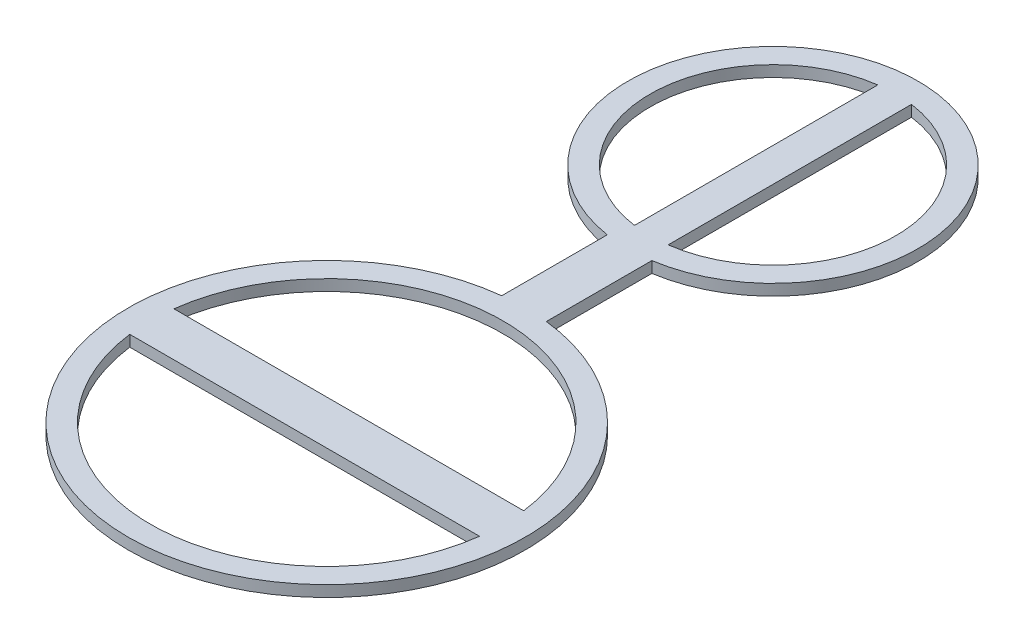
ISO-10303-21;
HEADER;
FILE_DESCRIPTION(('STEP AP214'),'2;1');
FILE_NAME('part.step','',(''),(''),'','','');
FILE_SCHEMA(('AUTOMOTIVE_DESIGN { 1 0 10303 214 1 1 1 1 }'));
ENDSEC;
DATA;
#1=APPLICATION_CONTEXT('core data for automotive mechanical design processes');
#2=APPLICATION_PROTOCOL_DEFINITION('international standard','automotive_design',2000,#1);
#3=PRODUCT_CONTEXT('',#1,'mechanical');
#4=PRODUCT('Part','Part','',(#3));
#5=PRODUCT_RELATED_PRODUCT_CATEGORY('part','',(#4));
#6=PRODUCT_DEFINITION_FORMATION('','',#4);
#7=PRODUCT_DEFINITION_CONTEXT('part definition',#1,'design');
#8=PRODUCT_DEFINITION('design','',#6,#7);
#9=PRODUCT_DEFINITION_SHAPE('','',#8);
#10=(LENGTH_UNIT() NAMED_UNIT(*) SI_UNIT(.MILLI.,.METRE.));
#11=(NAMED_UNIT(*) PLANE_ANGLE_UNIT() SI_UNIT($,.RADIAN.));
#12=(NAMED_UNIT(*) SI_UNIT($,.STERADIAN.) SOLID_ANGLE_UNIT());
#13=UNCERTAINTY_MEASURE_WITH_UNIT(LENGTH_MEASURE(1.E-05),#10,'distance_accuracy_value','');
#14=(GEOMETRIC_REPRESENTATION_CONTEXT(3) GLOBAL_UNCERTAINTY_ASSIGNED_CONTEXT((#13)) GLOBAL_UNIT_ASSIGNED_CONTEXT((#10,
#11,#12)) REPRESENTATION_CONTEXT('',''));
#15=CARTESIAN_POINT('',(0.,0.,0.));
#16=DIRECTION('',(0.,0.,1.));
#17=DIRECTION('',(1.,0.,0.));
#18=AXIS2_PLACEMENT_3D('',#15,#16,#17);
#19=CARTESIAN_POINT('',(0.,5.,0.));
#20=DIRECTION('',(0.,-1.,0.));
#21=DIRECTION('',(0.,0.,-1.));
#22=AXIS2_PLACEMENT_3D('',#19,#20,#21);
#23=CYLINDRICAL_SURFACE('',#22,79.);
#24=CARTESIAN_POINT('',(0.,0.,0.));
#25=DIRECTION('',(0.,1.,0.));
#26=DIRECTION('',(0.,0.,1.));
#27=AXIS2_PLACEMENT_3D('',#24,#25,#26);
#28=CIRCLE('',#27,79.);
#29=CARTESIAN_POINT('',(-78.3772288359317,0.,9.90000000000001));
#30=VERTEX_POINT('',#29);
#31=CARTESIAN_POINT('',(78.3772288359317,0.,9.9));
#32=VERTEX_POINT('',#31);
#33=EDGE_CURVE('E208',#30,#32,#28,.T.);
#34=ORIENTED_EDGE('',*,*,#33,.F.);
#35=DIRECTION('',(0.,-1.,0.));
#36=VECTOR('',#35,1.);
#37=CARTESIAN_POINT('',(-78.3772288359317,5.,9.90000000000001));
#38=LINE('',#37,#36);
#39=CARTESIAN_POINT('',(-78.3772288359317,5.,9.90000000000001));
#40=VERTEX_POINT('',#39);
#41=EDGE_CURVE('E11',#40,#30,#38,.T.);
#42=ORIENTED_EDGE('',*,*,#41,.F.);
#43=CARTESIAN_POINT('',(0.,5.,0.));
#44=DIRECTION('',(0.,1.,0.));
#45=DIRECTION('',(0.,0.,1.));
#46=AXIS2_PLACEMENT_3D('',#43,#44,#45);
#47=CIRCLE('',#46,79.);
#48=CARTESIAN_POINT('',(78.3772288359317,5.,9.9));
#49=VERTEX_POINT('',#48);
#50=EDGE_CURVE('E162',#40,#49,#47,.T.);
#51=ORIENTED_EDGE('',*,*,#50,.T.);
#52=DIRECTION('',(0.,-1.,0.));
#53=VECTOR('',#52,1.);
#54=CARTESIAN_POINT('',(78.3772288359317,5.,9.9));
#55=LINE('',#54,#53);
#56=EDGE_CURVE('E55',#49,#32,#55,.T.);
#57=ORIENTED_EDGE('',*,*,#56,.T.);
#58=EDGE_LOOP('',(#34,#42,#51,#57));
#59=FACE_BOUND('',#58,.T.);
#60=ADVANCED_FACE('F44',(#59),#23,.F.);
#61=CARTESIAN_POINT('',(0.,5.,0.));
#62=DIRECTION('',(0.,-1.,0.));
#63=DIRECTION('',(0.,0.,-1.));
#64=AXIS2_PLACEMENT_3D('',#61,#62,#63);
#65=CYLINDRICAL_SURFACE('',#64,79.);
#66=CARTESIAN_POINT('',(0.,0.,0.));
#67=DIRECTION('',(0.,1.,0.));
#68=DIRECTION('',(0.,0.,1.));
#69=AXIS2_PLACEMENT_3D('',#66,#67,#68);
#70=CIRCLE('',#69,79.);
#71=CARTESIAN_POINT('',(78.3772288359317,0.,-9.9));
#72=VERTEX_POINT('',#71);
#73=CARTESIAN_POINT('',(-78.3772288359317,0.,-9.89999999999999));
#74=VERTEX_POINT('',#73);
#75=EDGE_CURVE('E203',#72,#74,#70,.T.);
#76=ORIENTED_EDGE('',*,*,#75,.F.);
#77=DIRECTION('',(0.,-1.,0.));
#78=VECTOR('',#77,1.);
#79=CARTESIAN_POINT('',(78.3772288359317,5.,-9.9));
#80=LINE('',#79,#78);
#81=CARTESIAN_POINT('',(78.3772288359317,5.,-9.9));
#82=VERTEX_POINT('',#81);
#83=EDGE_CURVE('E149',#82,#72,#80,.T.);
#84=ORIENTED_EDGE('',*,*,#83,.F.);
#85=CARTESIAN_POINT('',(0.,5.,0.));
#86=DIRECTION('',(0.,1.,0.));
#87=DIRECTION('',(0.,0.,1.));
#88=AXIS2_PLACEMENT_3D('',#85,#86,#87);
#89=CIRCLE('',#88,79.);
#90=CARTESIAN_POINT('',(-78.3772288359317,5.,-9.89999999999999));
#91=VERTEX_POINT('',#90);
#92=EDGE_CURVE('E153',#82,#91,#89,.T.);
#93=ORIENTED_EDGE('',*,*,#92,.T.);
#94=DIRECTION('',(0.,-1.,0.));
#95=VECTOR('',#94,1.);
#96=CARTESIAN_POINT('',(-78.3772288359317,5.,-9.89999999999999));
#97=LINE('',#96,#95);
#98=EDGE_CURVE('E138',#91,#74,#97,.T.);
#99=ORIENTED_EDGE('',*,*,#98,.T.);
#100=EDGE_LOOP('',(#76,#84,#93,#99));
#101=FACE_BOUND('',#100,.T.);
#102=ADVANCED_FACE('F154',(#101),#65,.F.);
#103=CARTESIAN_POINT('',(10.,5.,0.));
#104=DIRECTION('',(-1.,0.,0.));
#105=DIRECTION('',(0.,0.,1.));
#106=AXIS2_PLACEMENT_3D('',#103,#104,#105);
#107=PLANE('',#106);
#108=DIRECTION('',(0.,0.,-1.));
#109=VECTOR('',#108,1.);
#110=CARTESIAN_POINT('',(10.,0.,0.));
#111=LINE('',#110,#109);
#112=CARTESIAN_POINT('',(10.,0.,-88.436417837902));
#113=VERTEX_POINT('',#112);
#114=CARTESIAN_POINT('',(10.,0.,-135.72323514675));
#115=VERTEX_POINT('',#114);
#116=EDGE_CURVE('E188',#113,#115,#111,.T.);
#117=ORIENTED_EDGE('',*,*,#116,.T.);
#118=DIRECTION('',(0.,-1.,0.));
#119=VECTOR('',#118,1.);
#120=CARTESIAN_POINT('',(10.,5.,-135.72323514675));
#121=LINE('',#120,#119);
#122=CARTESIAN_POINT('',(10.,5.,-135.72323514675));
#123=VERTEX_POINT('',#122);
#124=EDGE_CURVE('E150',#123,#115,#121,.T.);
#125=ORIENTED_EDGE('',*,*,#124,.F.);
#126=DIRECTION('',(0.,0.,-1.));
#127=VECTOR('',#126,1.);
#128=CARTESIAN_POINT('',(10.,5.,0.));
#129=LINE('',#128,#127);
#130=CARTESIAN_POINT('',(10.,5.,-88.436417837902));
#131=VERTEX_POINT('',#130);
#132=EDGE_CURVE('E437',#131,#123,#129,.T.);
#133=ORIENTED_EDGE('',*,*,#132,.F.);
#134=DIRECTION('',(0.,-1.,0.));
#135=VECTOR('',#134,1.);
#136=CARTESIAN_POINT('',(10.,5.,-88.436417837902));
#137=LINE('',#136,#135);
#138=EDGE_CURVE('E220',#131,#113,#137,.T.);
#139=ORIENTED_EDGE('',*,*,#138,.T.);
#140=EDGE_LOOP('',(#117,#125,#133,#139));
#141=FACE_BOUND('',#140,.T.);
#142=ADVANCED_FACE('F265',(#141),#107,.F.);
#143=CARTESIAN_POINT('',(0.,5.,-200.));
#144=DIRECTION('',(0.,-1.,0.));
#145=DIRECTION('',(0.,0.,-1.));
#146=AXIS2_PLACEMENT_3D('',#143,#144,#145);
#147=CYLINDRICAL_SURFACE('',#146,65.05);
#148=CARTESIAN_POINT('',(0.,0.,-200.));
#149=DIRECTION('',(0.,1.,0.));
#150=DIRECTION('',(0.,0.,1.));
#151=AXIS2_PLACEMENT_3D('',#148,#149,#150);
#152=CIRCLE('',#151,65.05);
#153=CARTESIAN_POINT('',(-10.,0.,-135.72323514675));
#154=VERTEX_POINT('',#153);
#155=EDGE_CURVE('E192',#115,#154,#152,.T.);
#156=ORIENTED_EDGE('',*,*,#155,.T.);
#157=DIRECTION('',(0.,-1.,0.));
#158=VECTOR('',#157,1.);
#159=CARTESIAN_POINT('',(-10.,5.,-135.72323514675));
#160=LINE('',#159,#158);
#161=CARTESIAN_POINT('',(-10.,5.,-135.72323514675));
#162=VERTEX_POINT('',#161);
#163=EDGE_CURVE('E228',#162,#154,#160,.T.);
#164=ORIENTED_EDGE('',*,*,#163,.F.);
#165=CARTESIAN_POINT('',(0.,5.,-200.));
#166=DIRECTION('',(0.,1.,0.));
#167=DIRECTION('',(0.,0.,1.));
#168=AXIS2_PLACEMENT_3D('',#165,#166,#167);
#169=CIRCLE('',#168,65.05);
#170=EDGE_CURVE('E440',#123,#162,#169,.T.);
#171=ORIENTED_EDGE('',*,*,#170,.F.);
#172=ORIENTED_EDGE('',*,*,#124,.T.);
#173=EDGE_LOOP('',(#156,#164,#171,#172));
#174=FACE_BOUND('',#173,.T.);
#175=ADVANCED_FACE('F277',(#174),#147,.T.);
#176=CARTESIAN_POINT('',(-10.,5.,0.));
#177=DIRECTION('',(-1.,0.,0.));
#178=DIRECTION('',(0.,0.,1.));
#179=AXIS2_PLACEMENT_3D('',#176,#177,#178);
#180=PLANE('',#179);
#181=DIRECTION('',(0.,0.,-1.));
#182=VECTOR('',#181,1.);
#183=CARTESIAN_POINT('',(-10.,0.,0.));
#184=LINE('',#183,#182);
#185=CARTESIAN_POINT('',(-10.,0.,-88.436417837902));
#186=VERTEX_POINT('',#185);
#187=EDGE_CURVE('E196',#186,#154,#184,.T.);
#188=ORIENTED_EDGE('',*,*,#187,.F.);
#189=DIRECTION('',(0.,-1.,0.));
#190=VECTOR('',#189,1.);
#191=CARTESIAN_POINT('',(-10.,5.,-88.436417837902));
#192=LINE('',#191,#190);
#193=CARTESIAN_POINT('',(-10.,5.,-88.436417837902));
#194=VERTEX_POINT('',#193);
#195=EDGE_CURVE('E224',#194,#186,#192,.T.);
#196=ORIENTED_EDGE('',*,*,#195,.F.);
#197=DIRECTION('',(0.,0.,-1.));
#198=VECTOR('',#197,1.);
#199=CARTESIAN_POINT('',(-10.,5.,0.));
#200=LINE('',#199,#198);
#201=EDGE_CURVE('E450',#194,#162,#200,.T.);
#202=ORIENTED_EDGE('',*,*,#201,.T.);
#203=ORIENTED_EDGE('',*,*,#163,.T.);
#204=EDGE_LOOP('',(#188,#196,#202,#203));
#205=FACE_BOUND('',#204,.T.);
#206=ADVANCED_FACE('F257',(#205),#180,.T.);
#207=CARTESIAN_POINT('',(7.55000000000071,5.,0.));
#208=DIRECTION('',(1.,0.,0.));
#209=DIRECTION('',(0.,0.,-1.));
#210=AXIS2_PLACEMENT_3D('',#207,#208,#209);
#211=PLANE('',#210);
#212=DIRECTION('',(0.,0.,1.));
#213=VECTOR('',#212,1.);
#214=CARTESIAN_POINT('',(7.55000000000071,0.,0.));
#215=LINE('',#214,#213);
#216=CARTESIAN_POINT('',(7.54999999999981,0.,-254.529808362033));
#217=VERTEX_POINT('',#216);
#218=CARTESIAN_POINT('',(7.55000000000019,0.,-145.470191637967));
#219=VERTEX_POINT('',#218);
#220=EDGE_CURVE('E180',#217,#219,#215,.T.);
#221=ORIENTED_EDGE('',*,*,#220,.F.);
#222=DIRECTION('',(0.,-1.,0.));
#223=VECTOR('',#222,1.);
#224=CARTESIAN_POINT('',(7.54999999999981,5.,-254.529808362033));
#225=LINE('',#224,#223);
#226=CARTESIAN_POINT('',(7.54999999999981,5.,-254.529808362033));
#227=VERTEX_POINT('',#226);
#228=EDGE_CURVE('E225',#227,#217,#225,.T.);
#229=ORIENTED_EDGE('',*,*,#228,.F.);
#230=DIRECTION('',(0.,0.,1.));
#231=VECTOR('',#230,1.);
#232=CARTESIAN_POINT('',(7.55000000000071,5.,0.));
#233=LINE('',#232,#231);
#234=CARTESIAN_POINT('',(7.55000000000019,5.,-145.470191637967));
#235=VERTEX_POINT('',#234);
#236=EDGE_CURVE('E433',#227,#235,#233,.T.);
#237=ORIENTED_EDGE('',*,*,#236,.T.);
#238=DIRECTION('',(0.,-1.,0.));
#239=VECTOR('',#238,1.);
#240=CARTESIAN_POINT('',(7.55000000000019,5.,-145.470191637967));
#241=LINE('',#240,#239);
#242=EDGE_CURVE('E234',#235,#219,#241,.T.);
#243=ORIENTED_EDGE('',*,*,#242,.T.);
#244=EDGE_LOOP('',(#221,#229,#237,#243));
#245=FACE_BOUND('',#244,.T.);
#246=ADVANCED_FACE('F250',(#245),#211,.T.);
#247=CARTESIAN_POINT('',(0.,5.,-200.));
#248=DIRECTION('',(0.,-1.,0.));
#249=DIRECTION('',(0.,0.,-1.));
#250=AXIS2_PLACEMENT_3D('',#247,#248,#249);
#251=CYLINDRICAL_SURFACE('',#250,55.05);
#252=CARTESIAN_POINT('',(0.,0.,-200.));
#253=DIRECTION('',(0.,1.,0.));
#254=DIRECTION('',(0.,0.,1.));
#255=AXIS2_PLACEMENT_3D('',#252,#253,#254);
#256=CIRCLE('',#255,55.05);
#257=CARTESIAN_POINT('',(-7.55000000000019,0.,-254.529808362033));
#258=VERTEX_POINT('',#257);
#259=CARTESIAN_POINT('',(-7.54999999999981,0.,-145.470191637967));
#260=VERTEX_POINT('',#259);
#261=EDGE_CURVE('E172',#258,#260,#256,.T.);
#262=ORIENTED_EDGE('',*,*,#261,.F.);
#263=DIRECTION('',(0.,-1.,0.));
#264=VECTOR('',#263,1.);
#265=CARTESIAN_POINT('',(-7.55000000000019,5.,-254.529808362033));
#266=LINE('',#265,#264);
#267=CARTESIAN_POINT('',(-7.55000000000019,5.,-254.529808362033));
#268=VERTEX_POINT('',#267);
#269=EDGE_CURVE('E48',#268,#258,#266,.T.);
#270=ORIENTED_EDGE('',*,*,#269,.F.);
#271=CARTESIAN_POINT('',(0.,5.,-200.));
#272=DIRECTION('',(0.,1.,0.));
#273=DIRECTION('',(0.,0.,1.));
#274=AXIS2_PLACEMENT_3D('',#271,#272,#273);
#275=CIRCLE('',#274,55.05);
#276=CARTESIAN_POINT('',(-7.54999999999981,5.,-145.470191637967));
#277=VERTEX_POINT('',#276);
#278=EDGE_CURVE('E215',#268,#277,#275,.T.);
#279=ORIENTED_EDGE('',*,*,#278,.T.);
#280=DIRECTION('',(0.,-1.,0.));
#281=VECTOR('',#280,1.);
#282=CARTESIAN_POINT('',(-7.54999999999981,5.,-145.470191637967));
#283=LINE('',#282,#281);
#284=EDGE_CURVE('E171',#277,#260,#283,.T.);
#285=ORIENTED_EDGE('',*,*,#284,.T.);
#286=EDGE_LOOP('',(#262,#270,#279,#285));
#287=FACE_BOUND('',#286,.T.);
#288=ADVANCED_FACE('F46',(#287),#251,.F.);
#289=CARTESIAN_POINT('',(0.,5.,-9.9));
#290=DIRECTION('',(0.,0.,-1.));
#291=DIRECTION('',(-1.,0.,0.));
#292=AXIS2_PLACEMENT_3D('',#289,#290,#291);
#293=PLANE('',#292);
#294=DIRECTION('',(1.,0.,0.));
#295=VECTOR('',#294,1.);
#296=CARTESIAN_POINT('',(0.,0.,-9.9));
#297=LINE('',#296,#295);
#298=EDGE_CURVE('E144',#74,#72,#297,.T.);
#299=ORIENTED_EDGE('',*,*,#298,.F.);
#300=ORIENTED_EDGE('',*,*,#98,.F.);
#301=DIRECTION('',(1.,0.,0.));
#302=VECTOR('',#301,1.);
#303=CARTESIAN_POINT('',(0.,5.,-9.9));
#304=LINE('',#303,#302);
#305=EDGE_CURVE('E142',#91,#82,#304,.T.);
#306=ORIENTED_EDGE('',*,*,#305,.T.);
#307=ORIENTED_EDGE('',*,*,#83,.T.);
#308=EDGE_LOOP('',(#299,#300,#306,#307));
#309=FACE_BOUND('',#308,.T.);
#310=ADVANCED_FACE('F140',(#309),#293,.T.);
#311=CARTESIAN_POINT('',(0.,5.,0.));
#312=DIRECTION('',(0.,-1.,0.));
#313=DIRECTION('',(0.,0.,-1.));
#314=AXIS2_PLACEMENT_3D('',#311,#312,#313);
#315=CYLINDRICAL_SURFACE('',#314,89.);
#316=CARTESIAN_POINT('',(0.,0.,0.));
#317=DIRECTION('',(0.,1.,0.));
#318=DIRECTION('',(0.,0.,1.));
#319=AXIS2_PLACEMENT_3D('',#316,#317,#318);
#320=CIRCLE('',#319,89.);
#321=EDGE_CURVE('E200',#186,#113,#320,.T.);
#322=ORIENTED_EDGE('',*,*,#321,.T.);
#323=ORIENTED_EDGE('',*,*,#138,.F.);
#324=CARTESIAN_POINT('',(0.,5.,0.));
#325=DIRECTION('',(0.,1.,0.));
#326=DIRECTION('',(0.,0.,1.));
#327=AXIS2_PLACEMENT_3D('',#324,#325,#326);
#328=CIRCLE('',#327,89.);
#329=EDGE_CURVE('E157',#194,#131,#328,.T.);
#330=ORIENTED_EDGE('',*,*,#329,.F.);
#331=ORIENTED_EDGE('',*,*,#195,.T.);
#332=EDGE_LOOP('',(#322,#323,#330,#331));
#333=FACE_BOUND('',#332,.T.);
#334=ADVANCED_FACE('F255',(#333),#315,.T.);
#335=CARTESIAN_POINT('',(0.,5.,-200.));
#336=DIRECTION('',(0.,-1.,0.));
#337=DIRECTION('',(0.,0.,-1.));
#338=AXIS2_PLACEMENT_3D('',#335,#336,#337);
#339=CYLINDRICAL_SURFACE('',#338,55.05);
#340=CARTESIAN_POINT('',(0.,0.,-200.));
#341=DIRECTION('',(0.,1.,0.));
#342=DIRECTION('',(0.,0.,1.));
#343=AXIS2_PLACEMENT_3D('',#340,#341,#342);
#344=CIRCLE('',#343,55.05);
#345=EDGE_CURVE('E184',#219,#217,#344,.T.);
#346=ORIENTED_EDGE('',*,*,#345,.F.);
#347=ORIENTED_EDGE('',*,*,#242,.F.);
#348=CARTESIAN_POINT('',(0.,5.,-200.));
#349=DIRECTION('',(0.,1.,0.));
#350=DIRECTION('',(0.,0.,1.));
#351=AXIS2_PLACEMENT_3D('',#348,#349,#350);
#352=CIRCLE('',#351,55.05);
#353=EDGE_CURVE('E445',#235,#227,#352,.T.);
#354=ORIENTED_EDGE('',*,*,#353,.T.);
#355=ORIENTED_EDGE('',*,*,#228,.T.);
#356=EDGE_LOOP('',(#346,#347,#354,#355));
#357=FACE_BOUND('',#356,.T.);
#358=ADVANCED_FACE('F273',(#357),#339,.F.);
#359=CARTESIAN_POINT('',(-7.54999999999929,5.,0.));
#360=DIRECTION('',(1.,0.,0.));
#361=DIRECTION('',(0.,0.,-1.));
#362=AXIS2_PLACEMENT_3D('',#359,#360,#361);
#363=PLANE('',#362);
#364=DIRECTION('',(0.,0.,1.));
#365=VECTOR('',#364,1.);
#366=CARTESIAN_POINT('',(-7.54999999999929,0.,0.));
#367=LINE('',#366,#365);
#368=EDGE_CURVE('E176',#258,#260,#367,.T.);
#369=ORIENTED_EDGE('',*,*,#368,.T.);
#370=ORIENTED_EDGE('',*,*,#284,.F.);
#371=DIRECTION('',(0.,0.,1.));
#372=VECTOR('',#371,1.);
#373=CARTESIAN_POINT('',(-7.54999999999929,5.,0.));
#374=LINE('',#373,#372);
#375=EDGE_CURVE('E244',#268,#277,#374,.T.);
#376=ORIENTED_EDGE('',*,*,#375,.F.);
#377=ORIENTED_EDGE('',*,*,#269,.T.);
#378=EDGE_LOOP('',(#369,#370,#376,#377));
#379=FACE_BOUND('',#378,.T.);
#380=ADVANCED_FACE('F243',(#379),#363,.F.);
#381=CARTESIAN_POINT('',(0.,5.,9.9));
#382=DIRECTION('',(0.,0.,1.));
#383=DIRECTION('',(1.,0.,0.));
#384=AXIS2_PLACEMENT_3D('',#381,#382,#383);
#385=PLANE('',#384);
#386=DIRECTION('',(-1.,0.,0.));
#387=VECTOR('',#386,1.);
#388=CARTESIAN_POINT('',(0.,0.,9.9));
#389=LINE('',#388,#387);
#390=EDGE_CURVE('E211',#32,#30,#389,.T.);
#391=ORIENTED_EDGE('',*,*,#390,.F.);
#392=ORIENTED_EDGE('',*,*,#56,.F.);
#393=DIRECTION('',(-1.,0.,0.));
#394=VECTOR('',#393,1.);
#395=CARTESIAN_POINT('',(0.,5.,9.9));
#396=LINE('',#395,#394);
#397=EDGE_CURVE('E165',#49,#40,#396,.T.);
#398=ORIENTED_EDGE('',*,*,#397,.T.);
#399=ORIENTED_EDGE('',*,*,#41,.T.);
#400=EDGE_LOOP('',(#391,#392,#398,#399));
#401=FACE_BOUND('',#400,.T.);
#402=ADVANCED_FACE('F268',(#401),#385,.T.);
#403=CARTESIAN_POINT('',(0.,5.,0.));
#404=DIRECTION('',(0.,1.,0.));
#405=DIRECTION('',(0.,0.,1.));
#406=AXIS2_PLACEMENT_3D('',#403,#404,#405);
#407=PLANE('',#406);
#408=ORIENTED_EDGE('',*,*,#278,.F.);
#409=ORIENTED_EDGE('',*,*,#375,.T.);
#410=EDGE_LOOP('',(#408,#409));
#411=FACE_BOUND('',#410,.T.);
#412=ORIENTED_EDGE('',*,*,#236,.F.);
#413=ORIENTED_EDGE('',*,*,#353,.F.);
#414=EDGE_LOOP('',(#412,#413));
#415=FACE_BOUND('',#414,.T.);
#416=ORIENTED_EDGE('',*,*,#132,.T.);
#417=ORIENTED_EDGE('',*,*,#170,.T.);
#418=ORIENTED_EDGE('',*,*,#201,.F.);
#419=ORIENTED_EDGE('',*,*,#329,.T.);
#420=EDGE_LOOP('',(#416,#417,#418,#419));
#421=FACE_BOUND('',#420,.T.);
#422=ORIENTED_EDGE('',*,*,#92,.F.);
#423=ORIENTED_EDGE('',*,*,#305,.F.);
#424=EDGE_LOOP('',(#422,#423));
#425=FACE_BOUND('',#424,.T.);
#426=ORIENTED_EDGE('',*,*,#50,.F.);
#427=ORIENTED_EDGE('',*,*,#397,.F.);
#428=EDGE_LOOP('',(#426,#427));
#429=FACE_BOUND('',#428,.T.);
#430=ADVANCED_FACE('F159',(#411,#415,#421,#425,#429),#407,.T.);
#431=CARTESIAN_POINT('',(0.,0.,0.));
#432=DIRECTION('',(0.,1.,0.));
#433=DIRECTION('',(0.,0.,1.));
#434=AXIS2_PLACEMENT_3D('',#431,#432,#433);
#435=PLANE('',#434);
#436=ORIENTED_EDGE('',*,*,#261,.T.);
#437=ORIENTED_EDGE('',*,*,#368,.F.);
#438=EDGE_LOOP('',(#436,#437));
#439=FACE_BOUND('',#438,.T.);
#440=ORIENTED_EDGE('',*,*,#220,.T.);
#441=ORIENTED_EDGE('',*,*,#345,.T.);
#442=EDGE_LOOP('',(#440,#441));
#443=FACE_BOUND('',#442,.T.);
#444=ORIENTED_EDGE('',*,*,#116,.F.);
#445=ORIENTED_EDGE('',*,*,#321,.F.);
#446=ORIENTED_EDGE('',*,*,#187,.T.);
#447=ORIENTED_EDGE('',*,*,#155,.F.);
#448=EDGE_LOOP('',(#444,#445,#446,#447));
#449=FACE_BOUND('',#448,.T.);
#450=ORIENTED_EDGE('',*,*,#75,.T.);
#451=ORIENTED_EDGE('',*,*,#298,.T.);
#452=EDGE_LOOP('',(#450,#451));
#453=FACE_BOUND('',#452,.T.);
#454=ORIENTED_EDGE('',*,*,#33,.T.);
#455=ORIENTED_EDGE('',*,*,#390,.T.);
#456=EDGE_LOOP('',(#454,#455));
#457=FACE_BOUND('',#456,.T.);
#458=ADVANCED_FACE('F247',(#439,#443,#449,#453,#457),#435,.F.);
#459=CLOSED_SHELL('',(#60,#102,#142,#175,#206,#246,#288,#310,#334,#358,#380,#402,#430,#458));
#460=MANIFOLD_SOLID_BREP('B2',#459);
#461=ADVANCED_BREP_SHAPE_REPRESENTATION('',(#18,#460),#14);
#462=SHAPE_DEFINITION_REPRESENTATION(#9,#461);
ENDSEC;
END-ISO-10303-21;
